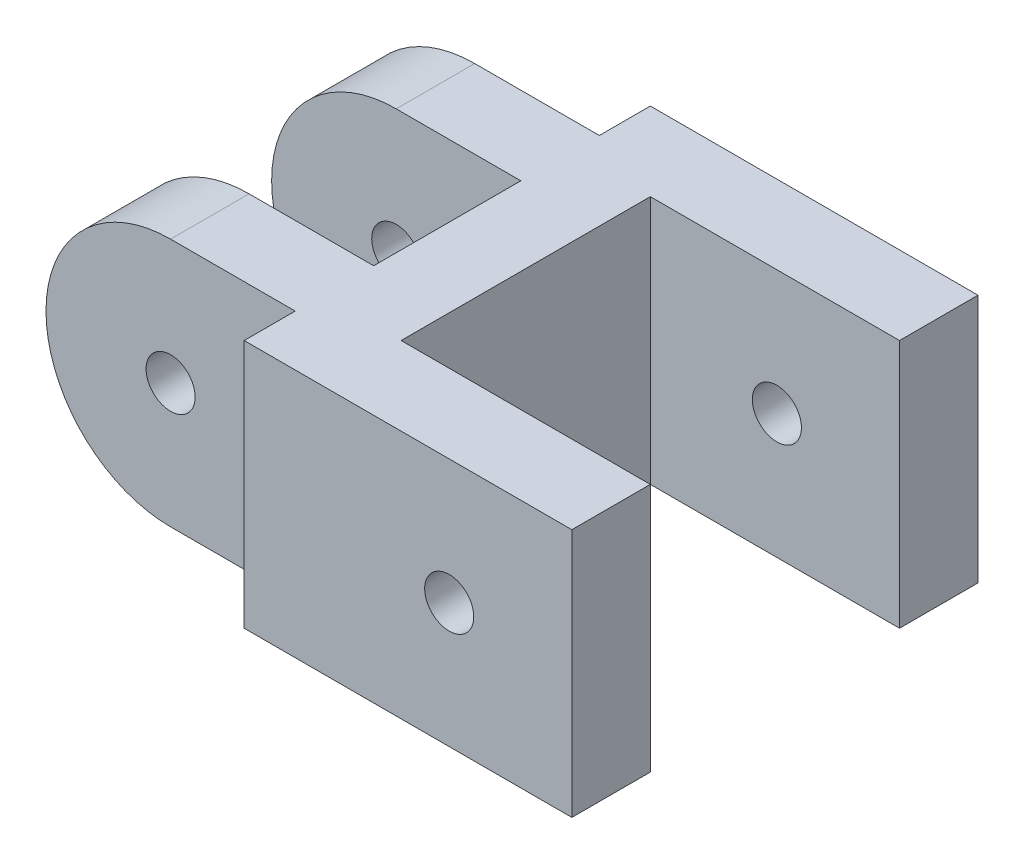
ISO-10303-21;
HEADER;
FILE_DESCRIPTION(('STEP AP214'),'2;1');
FILE_NAME('part.step','',(''),(''),'','','');
FILE_SCHEMA(('AUTOMOTIVE_DESIGN { 1 0 10303 214 1 1 1 1 }'));
ENDSEC;
DATA;
#1=APPLICATION_CONTEXT('core data for automotive mechanical design processes');
#2=APPLICATION_PROTOCOL_DEFINITION('international standard','automotive_design',2000,#1);
#3=PRODUCT_CONTEXT('',#1,'mechanical');
#4=PRODUCT('Part','Part','',(#3));
#5=PRODUCT_RELATED_PRODUCT_CATEGORY('part','',(#4));
#6=PRODUCT_DEFINITION_FORMATION('','',#4);
#7=PRODUCT_DEFINITION_CONTEXT('part definition',#1,'design');
#8=PRODUCT_DEFINITION('design','',#6,#7);
#9=PRODUCT_DEFINITION_SHAPE('','',#8);
#10=(LENGTH_UNIT() NAMED_UNIT(*) SI_UNIT(.MILLI.,.METRE.));
#11=(NAMED_UNIT(*) PLANE_ANGLE_UNIT() SI_UNIT($,.RADIAN.));
#12=(NAMED_UNIT(*) SI_UNIT($,.STERADIAN.) SOLID_ANGLE_UNIT());
#13=UNCERTAINTY_MEASURE_WITH_UNIT(LENGTH_MEASURE(1.E-05),#10,'distance_accuracy_value','');
#14=(GEOMETRIC_REPRESENTATION_CONTEXT(3) GLOBAL_UNCERTAINTY_ASSIGNED_CONTEXT((#13)) GLOBAL_UNIT_ASSIGNED_CONTEXT((#10,
#11,#12)) REPRESENTATION_CONTEXT('',''));
#15=CARTESIAN_POINT('',(0.,0.,0.));
#16=DIRECTION('',(0.,0.,1.));
#17=DIRECTION('',(1.,0.,0.));
#18=AXIS2_PLACEMENT_3D('',#15,#16,#17);
#19=CARTESIAN_POINT('',(10.375,25.4,-23.95));
#20=DIRECTION('',(-1.,0.,0.));
#21=DIRECTION('',(0.,0.,1.));
#22=AXIS2_PLACEMENT_3D('',#19,#20,#21);
#23=PLANE('',#22);
#24=DIRECTION('',(0.,0.,-1.));
#25=VECTOR('',#24,1.);
#26=CARTESIAN_POINT('',(10.375,0.,-23.95));
#27=LINE('',#26,#25);
#28=CARTESIAN_POINT('',(10.375,0.,-15.95));
#29=VERTEX_POINT('',#28);
#30=CARTESIAN_POINT('',(10.375,0.,-23.95));
#31=VERTEX_POINT('',#30);
#32=EDGE_CURVE('E183',#29,#31,#27,.T.);
#33=ORIENTED_EDGE('',*,*,#32,.T.);
#34=DIRECTION('',(0.,-1.,0.));
#35=VECTOR('',#34,1.);
#36=CARTESIAN_POINT('',(10.375,25.4,-23.95));
#37=LINE('',#36,#35);
#38=CARTESIAN_POINT('',(10.375,25.4,-23.95));
#39=VERTEX_POINT('',#38);
#40=EDGE_CURVE('E163',#39,#31,#37,.T.);
#41=ORIENTED_EDGE('',*,*,#40,.F.);
#42=DIRECTION('',(0.,0.,-1.));
#43=VECTOR('',#42,1.);
#44=CARTESIAN_POINT('',(10.375,25.4,-23.95));
#45=LINE('',#44,#43);
#46=CARTESIAN_POINT('',(10.375,25.4,-15.95));
#47=VERTEX_POINT('',#46);
#48=EDGE_CURVE('E170',#47,#39,#45,.T.);
#49=ORIENTED_EDGE('',*,*,#48,.F.);
#50=DIRECTION('',(0.,-1.,0.));
#51=VECTOR('',#50,1.);
#52=CARTESIAN_POINT('',(10.375,25.4,-15.95));
#53=LINE('',#52,#51);
#54=EDGE_CURVE('E251',#47,#29,#53,.T.);
#55=ORIENTED_EDGE('',*,*,#54,.T.);
#56=EDGE_LOOP('',(#33,#41,#49,#55));
#57=FACE_BOUND('',#56,.T.);
#58=ADVANCED_FACE('F33',(#57),#23,.F.);
#59=CARTESIAN_POINT('',(-23.025,25.4,-23.95));
#60=DIRECTION('',(0.,0.,1.));
#61=DIRECTION('',(1.,0.,0.));
#62=AXIS2_PLACEMENT_3D('',#59,#60,#61);
#63=PLANE('',#62);
#64=CARTESIAN_POINT('',(-2.12500000000001,12.7,-23.95));
#65=DIRECTION('',(0.,0.,1.));
#66=DIRECTION('',(1.,0.,0.));
#67=AXIS2_PLACEMENT_3D('',#64,#65,#66);
#68=CIRCLE('',#67,2.5);
#69=CARTESIAN_POINT('',(0.374999999999992,12.7,-23.95));
#70=VERTEX_POINT('',#69);
#71=EDGE_CURVE('E547',#70,#70,#68,.F.);
#72=ORIENTED_EDGE('',*,*,#71,.F.);
#73=EDGE_LOOP('',(#72));
#74=FACE_BOUND('',#73,.T.);
#75=DIRECTION('',(-1.,0.,0.));
#76=VECTOR('',#75,1.);
#77=CARTESIAN_POINT('',(-23.025,0.,-23.95));
#78=LINE('',#77,#76);
#79=CARTESIAN_POINT('',(-23.025,0.,-23.95));
#80=VERTEX_POINT('',#79);
#81=EDGE_CURVE('E253',#31,#80,#78,.T.);
#82=ORIENTED_EDGE('',*,*,#81,.T.);
#83=DIRECTION('',(0.,-1.,0.));
#84=VECTOR('',#83,1.);
#85=CARTESIAN_POINT('',(-23.025,25.4,-23.95));
#86=LINE('',#85,#84);
#87=CARTESIAN_POINT('',(-23.025,25.4,-23.95));
#88=VERTEX_POINT('',#87);
#89=EDGE_CURVE('E166',#88,#80,#86,.T.);
#90=ORIENTED_EDGE('',*,*,#89,.F.);
#91=DIRECTION('',(-1.,0.,0.));
#92=VECTOR('',#91,1.);
#93=CARTESIAN_POINT('',(-23.025,25.4,-23.95));
#94=LINE('',#93,#92);
#95=EDGE_CURVE('E159',#39,#88,#94,.T.);
#96=ORIENTED_EDGE('',*,*,#95,.F.);
#97=ORIENTED_EDGE('',*,*,#40,.T.);
#98=EDGE_LOOP('',(#82,#90,#96,#97));
#99=FACE_BOUND('',#98,.T.);
#100=ADVANCED_FACE('F161',(#74,#99),#63,.F.);
#101=CARTESIAN_POINT('',(-23.025,25.4,-18.75));
#102=DIRECTION('',(1.,0.,0.));
#103=DIRECTION('',(0.,0.,-1.));
#104=AXIS2_PLACEMENT_3D('',#101,#102,#103);
#105=PLANE('',#104);
#106=DIRECTION('',(0.,0.,1.));
#107=VECTOR('',#106,1.);
#108=CARTESIAN_POINT('',(-23.025,0.,-18.75));
#109=LINE('',#108,#107);
#110=CARTESIAN_POINT('',(-23.025,0.,-18.75));
#111=VERTEX_POINT('',#110);
#112=EDGE_CURVE('E255',#80,#111,#109,.T.);
#113=ORIENTED_EDGE('',*,*,#112,.T.);
#114=DIRECTION('',(0.,-1.,0.));
#115=VECTOR('',#114,1.);
#116=CARTESIAN_POINT('',(-23.025,25.4,-18.75));
#117=LINE('',#116,#115);
#118=CARTESIAN_POINT('',(-23.025,25.4,-18.75));
#119=VERTEX_POINT('',#118);
#120=EDGE_CURVE('E188',#119,#111,#117,.T.);
#121=ORIENTED_EDGE('',*,*,#120,.F.);
#122=DIRECTION('',(0.,0.,1.));
#123=VECTOR('',#122,1.);
#124=CARTESIAN_POINT('',(-23.025,25.4,-18.75));
#125=LINE('',#124,#123);
#126=EDGE_CURVE('E169',#88,#119,#125,.T.);
#127=ORIENTED_EDGE('',*,*,#126,.F.);
#128=ORIENTED_EDGE('',*,*,#89,.T.);
#129=EDGE_LOOP('',(#113,#121,#127,#128));
#130=FACE_BOUND('',#129,.T.);
#131=ADVANCED_FACE('F369',(#130),#105,.F.);
#132=CARTESIAN_POINT('',(-48.425,25.4,-18.75));
#133=DIRECTION('',(0.,0.,1.));
#134=DIRECTION('',(1.,0.,0.));
#135=AXIS2_PLACEMENT_3D('',#132,#133,#134);
#136=PLANE('',#135);
#137=CARTESIAN_POINT('',(-35.725,12.7,-18.75));
#138=DIRECTION('',(0.,0.,1.));
#139=DIRECTION('',(1.,0.,0.));
#140=AXIS2_PLACEMENT_3D('',#137,#138,#139);
#141=CIRCLE('',#140,2.5);
#142=CARTESIAN_POINT('',(-33.225,12.7,-18.75));
#143=VERTEX_POINT('',#142);
#144=EDGE_CURVE('E224',#143,#143,#141,.F.);
#145=ORIENTED_EDGE('',*,*,#144,.F.);
#146=EDGE_LOOP('',(#145));
#147=FACE_BOUND('',#146,.T.);
#148=CARTESIAN_POINT('',(-35.725,12.7,-18.75));
#149=DIRECTION('',(0.,0.,1.));
#150=DIRECTION('',(1.,0.,0.));
#151=AXIS2_PLACEMENT_3D('',#148,#149,#150);
#152=CIRCLE('',#151,12.7);
#153=CARTESIAN_POINT('',(-35.725,0.,-18.75));
#154=VERTEX_POINT('',#153);
#155=CARTESIAN_POINT('',(-48.425,12.7,-18.75));
#156=VERTEX_POINT('',#155);
#157=EDGE_CURVE('E198',#154,#156,#152,.F.);
#158=ORIENTED_EDGE('',*,*,#157,.T.);
#159=CARTESIAN_POINT('',(-35.725,12.7,-18.75));
#160=DIRECTION('',(0.,0.,1.));
#161=DIRECTION('',(1.,0.,0.));
#162=AXIS2_PLACEMENT_3D('',#159,#160,#161);
#163=CIRCLE('',#162,12.7);
#164=CARTESIAN_POINT('',(-35.725,25.4,-18.75));
#165=VERTEX_POINT('',#164);
#166=EDGE_CURVE('E200',#156,#165,#163,.F.);
#167=ORIENTED_EDGE('',*,*,#166,.T.);
#168=DIRECTION('',(-1.,0.,0.));
#169=VECTOR('',#168,1.);
#170=CARTESIAN_POINT('',(-48.425,25.4,-18.75));
#171=LINE('',#170,#169);
#172=EDGE_CURVE('E229',#119,#165,#171,.T.);
#173=ORIENTED_EDGE('',*,*,#172,.F.);
#174=ORIENTED_EDGE('',*,*,#120,.T.);
#175=DIRECTION('',(-1.,0.,0.));
#176=VECTOR('',#175,1.);
#177=CARTESIAN_POINT('',(-48.425,0.,-18.75));
#178=LINE('',#177,#176);
#179=EDGE_CURVE('E257',#111,#154,#178,.T.);
#180=ORIENTED_EDGE('',*,*,#179,.T.);
#181=EDGE_LOOP('',(#158,#167,#173,#174,#180));
#182=FACE_BOUND('',#181,.T.);
#183=ADVANCED_FACE('F308',(#147,#182),#136,.F.);
#184=CARTESIAN_POINT('',(-23.025,25.4,-10.75));
#185=DIRECTION('',(0.,0.,-1.));
#186=DIRECTION('',(-1.,0.,0.));
#187=AXIS2_PLACEMENT_3D('',#184,#185,#186);
#188=PLANE('',#187);
#189=CARTESIAN_POINT('',(-35.725,12.7,-10.75));
#190=DIRECTION('',(0.,0.,-1.));
#191=DIRECTION('',(-1.,0.,0.));
#192=AXIS2_PLACEMENT_3D('',#189,#190,#191);
#193=CIRCLE('',#192,2.5);
#194=CARTESIAN_POINT('',(-38.225,12.7,-10.75));
#195=VERTEX_POINT('',#194);
#196=EDGE_CURVE('E215',#195,#195,#193,.T.);
#197=ORIENTED_EDGE('',*,*,#196,.T.);
#198=EDGE_LOOP('',(#197));
#199=FACE_BOUND('',#198,.T.);
#200=DIRECTION('',(1.,0.,0.));
#201=VECTOR('',#200,1.);
#202=CARTESIAN_POINT('',(-23.025,25.4,-10.75));
#203=LINE('',#202,#201);
#204=CARTESIAN_POINT('',(-35.725,25.4,-10.75));
#205=VERTEX_POINT('',#204);
#206=CARTESIAN_POINT('',(-23.025,25.4,-10.75));
#207=VERTEX_POINT('',#206);
#208=EDGE_CURVE('E231',#205,#207,#203,.T.);
#209=ORIENTED_EDGE('',*,*,#208,.F.);
#210=CARTESIAN_POINT('',(-35.725,12.7,-10.75));
#211=DIRECTION('',(0.,0.,-1.));
#212=DIRECTION('',(-1.,0.,0.));
#213=AXIS2_PLACEMENT_3D('',#210,#211,#212);
#214=CIRCLE('',#213,12.7);
#215=CARTESIAN_POINT('',(-48.425,12.7,-10.75));
#216=VERTEX_POINT('',#215);
#217=EDGE_CURVE('E196',#205,#216,#214,.F.);
#218=ORIENTED_EDGE('',*,*,#217,.T.);
#219=CARTESIAN_POINT('',(-35.725,12.7,-10.75));
#220=DIRECTION('',(0.,0.,-1.));
#221=DIRECTION('',(-1.,0.,0.));
#222=AXIS2_PLACEMENT_3D('',#219,#220,#221);
#223=CIRCLE('',#222,12.7);
#224=CARTESIAN_POINT('',(-35.725,0.,-10.75));
#225=VERTEX_POINT('',#224);
#226=EDGE_CURVE('E194',#216,#225,#223,.F.);
#227=ORIENTED_EDGE('',*,*,#226,.T.);
#228=DIRECTION('',(1.,0.,0.));
#229=VECTOR('',#228,1.);
#230=CARTESIAN_POINT('',(-23.025,0.,-10.75));
#231=LINE('',#230,#229);
#232=CARTESIAN_POINT('',(-23.025,0.,-10.75));
#233=VERTEX_POINT('',#232);
#234=EDGE_CURVE('E260',#225,#233,#231,.T.);
#235=ORIENTED_EDGE('',*,*,#234,.T.);
#236=DIRECTION('',(0.,-1.,0.));
#237=VECTOR('',#236,1.);
#238=CARTESIAN_POINT('',(-23.025,25.4,-10.75));
#239=LINE('',#238,#237);
#240=EDGE_CURVE('E301',#207,#233,#239,.T.);
#241=ORIENTED_EDGE('',*,*,#240,.F.);
#242=EDGE_LOOP('',(#209,#218,#227,#235,#241));
#243=FACE_BOUND('',#242,.T.);
#244=ADVANCED_FACE('F327',(#199,#243),#188,.F.);
#245=CARTESIAN_POINT('',(-23.025,25.4,4.25000000000001));
#246=DIRECTION('',(1.,0.,0.));
#247=DIRECTION('',(0.,0.,-1.));
#248=AXIS2_PLACEMENT_3D('',#245,#246,#247);
#249=PLANE('',#248);
#250=DIRECTION('',(0.,0.,1.));
#251=VECTOR('',#250,1.);
#252=CARTESIAN_POINT('',(-23.025,0.,4.25000000000001));
#253=LINE('',#252,#251);
#254=CARTESIAN_POINT('',(-23.025,0.,4.25000000000001));
#255=VERTEX_POINT('',#254);
#256=EDGE_CURVE('E262',#233,#255,#253,.T.);
#257=ORIENTED_EDGE('',*,*,#256,.T.);
#258=DIRECTION('',(0.,-1.,0.));
#259=VECTOR('',#258,1.);
#260=CARTESIAN_POINT('',(-23.025,25.4,4.25000000000001));
#261=LINE('',#260,#259);
#262=CARTESIAN_POINT('',(-23.025,25.4,4.25000000000001));
#263=VERTEX_POINT('',#262);
#264=EDGE_CURVE('E298',#263,#255,#261,.T.);
#265=ORIENTED_EDGE('',*,*,#264,.F.);
#266=DIRECTION('',(0.,0.,1.));
#267=VECTOR('',#266,1.);
#268=CARTESIAN_POINT('',(-23.025,25.4,4.25000000000001));
#269=LINE('',#268,#267);
#270=EDGE_CURVE('E233',#207,#263,#269,.T.);
#271=ORIENTED_EDGE('',*,*,#270,.F.);
#272=ORIENTED_EDGE('',*,*,#240,.T.);
#273=EDGE_LOOP('',(#257,#265,#271,#272));
#274=FACE_BOUND('',#273,.T.);
#275=ADVANCED_FACE('F334',(#274),#249,.F.);
#276=CARTESIAN_POINT('',(-48.425,25.4,4.25000000000001));
#277=DIRECTION('',(0.,0.,1.));
#278=DIRECTION('',(1.,0.,0.));
#279=AXIS2_PLACEMENT_3D('',#276,#277,#278);
#280=PLANE('',#279);
#281=CARTESIAN_POINT('',(-35.725,12.7,4.25));
#282=DIRECTION('',(0.,0.,1.));
#283=DIRECTION('',(1.,0.,0.));
#284=AXIS2_PLACEMENT_3D('',#281,#282,#283);
#285=CIRCLE('',#284,2.5);
#286=CARTESIAN_POINT('',(-33.225,12.7,4.25));
#287=VERTEX_POINT('',#286);
#288=EDGE_CURVE('E219',#287,#287,#285,.T.);
#289=ORIENTED_EDGE('',*,*,#288,.T.);
#290=EDGE_LOOP('',(#289));
#291=FACE_BOUND('',#290,.T.);
#292=DIRECTION('',(-1.,0.,0.));
#293=VECTOR('',#292,1.);
#294=CARTESIAN_POINT('',(-48.425,0.,4.25000000000001));
#295=LINE('',#294,#293);
#296=CARTESIAN_POINT('',(-35.725,0.,4.25000000000001));
#297=VERTEX_POINT('',#296);
#298=EDGE_CURVE('E264',#255,#297,#295,.T.);
#299=ORIENTED_EDGE('',*,*,#298,.T.);
#300=CARTESIAN_POINT('',(-35.725,12.7,4.25000000000001));
#301=DIRECTION('',(0.,0.,1.));
#302=DIRECTION('',(1.,0.,0.));
#303=AXIS2_PLACEMENT_3D('',#300,#301,#302);
#304=CIRCLE('',#303,12.7);
#305=CARTESIAN_POINT('',(-48.425,12.7,4.25000000000001));
#306=VERTEX_POINT('',#305);
#307=EDGE_CURVE('E11',#297,#306,#304,.F.);
#308=ORIENTED_EDGE('',*,*,#307,.T.);
#309=CARTESIAN_POINT('',(-35.725,12.7,4.25000000000001));
#310=DIRECTION('',(0.,0.,1.));
#311=DIRECTION('',(1.,0.,0.));
#312=AXIS2_PLACEMENT_3D('',#309,#310,#311);
#313=CIRCLE('',#312,12.7);
#314=CARTESIAN_POINT('',(-35.725,25.4,4.25000000000001));
#315=VERTEX_POINT('',#314);
#316=EDGE_CURVE('E42',#306,#315,#313,.F.);
#317=ORIENTED_EDGE('',*,*,#316,.T.);
#318=DIRECTION('',(-1.,0.,0.));
#319=VECTOR('',#318,1.);
#320=CARTESIAN_POINT('',(-48.425,25.4,4.25000000000001));
#321=LINE('',#320,#319);
#322=EDGE_CURVE('E235',#263,#315,#321,.T.);
#323=ORIENTED_EDGE('',*,*,#322,.F.);
#324=ORIENTED_EDGE('',*,*,#264,.T.);
#325=EDGE_LOOP('',(#299,#308,#317,#323,#324));
#326=FACE_BOUND('',#325,.T.);
#327=ADVANCED_FACE('F336',(#291,#326),#280,.F.);
#328=CARTESIAN_POINT('',(-23.025,25.4,12.25));
#329=DIRECTION('',(0.,0.,-1.));
#330=DIRECTION('',(-1.,0.,0.));
#331=AXIS2_PLACEMENT_3D('',#328,#329,#330);
#332=PLANE('',#331);
#333=CARTESIAN_POINT('',(-35.725,12.7,12.25));
#334=DIRECTION('',(0.,0.,1.));
#335=DIRECTION('',(1.,0.,0.));
#336=AXIS2_PLACEMENT_3D('',#333,#334,#335);
#337=CIRCLE('',#336,2.5);
#338=CARTESIAN_POINT('',(-33.225,12.7,12.25));
#339=VERTEX_POINT('',#338);
#340=EDGE_CURVE('E542',#339,#339,#337,.T.);
#341=ORIENTED_EDGE('',*,*,#340,.F.);
#342=EDGE_LOOP('',(#341));
#343=FACE_BOUND('',#342,.T.);
#344=CARTESIAN_POINT('',(-35.725,12.7,12.25));
#345=DIRECTION('',(0.,0.,-1.));
#346=DIRECTION('',(-1.,0.,0.));
#347=AXIS2_PLACEMENT_3D('',#344,#345,#346);
#348=CIRCLE('',#347,12.7);
#349=CARTESIAN_POINT('',(-35.725,25.4,12.25));
#350=VERTEX_POINT('',#349);
#351=CARTESIAN_POINT('',(-48.425,12.7,12.25));
#352=VERTEX_POINT('',#351);
#353=EDGE_CURVE('E56',#350,#352,#348,.F.);
#354=ORIENTED_EDGE('',*,*,#353,.T.);
#355=CARTESIAN_POINT('',(-35.725,12.7,12.25));
#356=DIRECTION('',(0.,0.,-1.));
#357=DIRECTION('',(-1.,0.,0.));
#358=AXIS2_PLACEMENT_3D('',#355,#356,#357);
#359=CIRCLE('',#358,12.7);
#360=CARTESIAN_POINT('',(-35.725,0.,12.25));
#361=VERTEX_POINT('',#360);
#362=EDGE_CURVE('E208',#352,#361,#359,.F.);
#363=ORIENTED_EDGE('',*,*,#362,.T.);
#364=DIRECTION('',(1.,0.,0.));
#365=VECTOR('',#364,1.);
#366=CARTESIAN_POINT('',(-23.025,0.,12.25));
#367=LINE('',#366,#365);
#368=CARTESIAN_POINT('',(-23.025,0.,12.25));
#369=VERTEX_POINT('',#368);
#370=EDGE_CURVE('E266',#361,#369,#367,.T.);
#371=ORIENTED_EDGE('',*,*,#370,.T.);
#372=DIRECTION('',(0.,-1.,0.));
#373=VECTOR('',#372,1.);
#374=CARTESIAN_POINT('',(-23.025,25.4,12.25));
#375=LINE('',#374,#373);
#376=CARTESIAN_POINT('',(-23.025,25.4,12.25));
#377=VERTEX_POINT('',#376);
#378=EDGE_CURVE('E295',#377,#369,#375,.T.);
#379=ORIENTED_EDGE('',*,*,#378,.F.);
#380=DIRECTION('',(1.,0.,0.));
#381=VECTOR('',#380,1.);
#382=CARTESIAN_POINT('',(-23.025,25.4,12.25));
#383=LINE('',#382,#381);
#384=EDGE_CURVE('E238',#350,#377,#383,.T.);
#385=ORIENTED_EDGE('',*,*,#384,.F.);
#386=EDGE_LOOP('',(#354,#363,#371,#379,#385));
#387=FACE_BOUND('',#386,.T.);
#388=ADVANCED_FACE('F339',(#343,#387),#332,.F.);
#389=CARTESIAN_POINT('',(-23.025,25.4,17.45));
#390=DIRECTION('',(1.,0.,0.));
#391=DIRECTION('',(0.,0.,-1.));
#392=AXIS2_PLACEMENT_3D('',#389,#390,#391);
#393=PLANE('',#392);
#394=DIRECTION('',(0.,0.,1.));
#395=VECTOR('',#394,1.);
#396=CARTESIAN_POINT('',(-23.025,0.,17.45));
#397=LINE('',#396,#395);
#398=CARTESIAN_POINT('',(-23.025,0.,17.45));
#399=VERTEX_POINT('',#398);
#400=EDGE_CURVE('E268',#369,#399,#397,.T.);
#401=ORIENTED_EDGE('',*,*,#400,.T.);
#402=DIRECTION('',(0.,-1.,0.));
#403=VECTOR('',#402,1.);
#404=CARTESIAN_POINT('',(-23.025,25.4,17.45));
#405=LINE('',#404,#403);
#406=CARTESIAN_POINT('',(-23.025,25.4,17.45));
#407=VERTEX_POINT('',#406);
#408=EDGE_CURVE('E292',#407,#399,#405,.T.);
#409=ORIENTED_EDGE('',*,*,#408,.F.);
#410=DIRECTION('',(0.,0.,1.));
#411=VECTOR('',#410,1.);
#412=CARTESIAN_POINT('',(-23.025,25.4,17.45));
#413=LINE('',#412,#411);
#414=EDGE_CURVE('E240',#377,#407,#413,.T.);
#415=ORIENTED_EDGE('',*,*,#414,.F.);
#416=ORIENTED_EDGE('',*,*,#378,.T.);
#417=EDGE_LOOP('',(#401,#409,#415,#416));
#418=FACE_BOUND('',#417,.T.);
#419=ADVANCED_FACE('F345',(#418),#393,.F.);
#420=CARTESIAN_POINT('',(10.375,25.4,17.45));
#421=DIRECTION('',(0.,0.,-1.));
#422=DIRECTION('',(-1.,0.,0.));
#423=AXIS2_PLACEMENT_3D('',#420,#421,#422);
#424=PLANE('',#423);
#425=CARTESIAN_POINT('',(-2.12500000000001,12.7,17.45));
#426=DIRECTION('',(0.,0.,1.));
#427=DIRECTION('',(1.,0.,0.));
#428=AXIS2_PLACEMENT_3D('',#425,#426,#427);
#429=CIRCLE('',#428,2.5);
#430=CARTESIAN_POINT('',(0.374999999999992,12.7,17.45));
#431=VERTEX_POINT('',#430);
#432=EDGE_CURVE('E538',#431,#431,#429,.T.);
#433=ORIENTED_EDGE('',*,*,#432,.F.);
#434=EDGE_LOOP('',(#433));
#435=FACE_BOUND('',#434,.T.);
#436=DIRECTION('',(1.,0.,0.));
#437=VECTOR('',#436,1.);
#438=CARTESIAN_POINT('',(10.375,0.,17.45));
#439=LINE('',#438,#437);
#440=CARTESIAN_POINT('',(10.375,0.,17.45));
#441=VERTEX_POINT('',#440);
#442=EDGE_CURVE('E270',#399,#441,#439,.T.);
#443=ORIENTED_EDGE('',*,*,#442,.T.);
#444=DIRECTION('',(0.,-1.,0.));
#445=VECTOR('',#444,1.);
#446=CARTESIAN_POINT('',(10.375,25.4,17.45));
#447=LINE('',#446,#445);
#448=CARTESIAN_POINT('',(10.375,25.4,17.45));
#449=VERTEX_POINT('',#448);
#450=EDGE_CURVE('E289',#449,#441,#447,.T.);
#451=ORIENTED_EDGE('',*,*,#450,.F.);
#452=DIRECTION('',(1.,0.,0.));
#453=VECTOR('',#452,1.);
#454=CARTESIAN_POINT('',(10.375,25.4,17.45));
#455=LINE('',#454,#453);
#456=EDGE_CURVE('E242',#407,#449,#455,.T.);
#457=ORIENTED_EDGE('',*,*,#456,.F.);
#458=ORIENTED_EDGE('',*,*,#408,.T.);
#459=EDGE_LOOP('',(#443,#451,#457,#458));
#460=FACE_BOUND('',#459,.T.);
#461=ADVANCED_FACE('F351',(#435,#460),#424,.F.);
#462=CARTESIAN_POINT('',(10.375,25.4,9.45000000000001));
#463=DIRECTION('',(-1.,0.,0.));
#464=DIRECTION('',(0.,0.,1.));
#465=AXIS2_PLACEMENT_3D('',#462,#463,#464);
#466=PLANE('',#465);
#467=DIRECTION('',(0.,0.,-1.));
#468=VECTOR('',#467,1.);
#469=CARTESIAN_POINT('',(10.375,0.,9.45000000000001));
#470=LINE('',#469,#468);
#471=CARTESIAN_POINT('',(10.375,0.,9.45000000000001));
#472=VERTEX_POINT('',#471);
#473=EDGE_CURVE('E272',#441,#472,#470,.T.);
#474=ORIENTED_EDGE('',*,*,#473,.T.);
#475=DIRECTION('',(0.,-1.,0.));
#476=VECTOR('',#475,1.);
#477=CARTESIAN_POINT('',(10.375,25.4,9.45000000000001));
#478=LINE('',#477,#476);
#479=CARTESIAN_POINT('',(10.375,25.4,9.45000000000001));
#480=VERTEX_POINT('',#479);
#481=EDGE_CURVE('E286',#480,#472,#478,.T.);
#482=ORIENTED_EDGE('',*,*,#481,.F.);
#483=DIRECTION('',(0.,0.,-1.));
#484=VECTOR('',#483,1.);
#485=CARTESIAN_POINT('',(10.375,25.4,9.45000000000001));
#486=LINE('',#485,#484);
#487=EDGE_CURVE('E244',#449,#480,#486,.T.);
#488=ORIENTED_EDGE('',*,*,#487,.F.);
#489=ORIENTED_EDGE('',*,*,#450,.T.);
#490=EDGE_LOOP('',(#474,#482,#488,#489));
#491=FACE_BOUND('',#490,.T.);
#492=ADVANCED_FACE('F355',(#491),#466,.F.);
#493=CARTESIAN_POINT('',(-15.025,25.4,9.45000000000001));
#494=DIRECTION('',(0.,0.,1.));
#495=DIRECTION('',(1.,0.,0.));
#496=AXIS2_PLACEMENT_3D('',#493,#494,#495);
#497=PLANE('',#496);
#498=CARTESIAN_POINT('',(-2.12500000000001,12.7,9.45000000000001));
#499=DIRECTION('',(0.,0.,1.));
#500=DIRECTION('',(1.,0.,0.));
#501=AXIS2_PLACEMENT_3D('',#498,#499,#500);
#502=CIRCLE('',#501,2.5);
#503=CARTESIAN_POINT('',(0.374999999999992,12.7,9.45));
#504=VERTEX_POINT('',#503);
#505=EDGE_CURVE('E541',#504,#504,#502,.T.);
#506=ORIENTED_EDGE('',*,*,#505,.T.);
#507=EDGE_LOOP('',(#506));
#508=FACE_BOUND('',#507,.T.);
#509=DIRECTION('',(-1.,0.,0.));
#510=VECTOR('',#509,1.);
#511=CARTESIAN_POINT('',(-15.025,0.,9.45000000000001));
#512=LINE('',#511,#510);
#513=CARTESIAN_POINT('',(-15.025,0.,9.45000000000001));
#514=VERTEX_POINT('',#513);
#515=EDGE_CURVE('E274',#472,#514,#512,.T.);
#516=ORIENTED_EDGE('',*,*,#515,.T.);
#517=DIRECTION('',(0.,-1.,0.));
#518=VECTOR('',#517,1.);
#519=CARTESIAN_POINT('',(-15.025,25.4,9.45000000000001));
#520=LINE('',#519,#518);
#521=CARTESIAN_POINT('',(-15.025,25.4,9.45000000000001));
#522=VERTEX_POINT('',#521);
#523=EDGE_CURVE('E283',#522,#514,#520,.T.);
#524=ORIENTED_EDGE('',*,*,#523,.F.);
#525=DIRECTION('',(-1.,0.,0.));
#526=VECTOR('',#525,1.);
#527=CARTESIAN_POINT('',(-15.025,25.4,9.45000000000001));
#528=LINE('',#527,#526);
#529=EDGE_CURVE('E246',#480,#522,#528,.T.);
#530=ORIENTED_EDGE('',*,*,#529,.F.);
#531=ORIENTED_EDGE('',*,*,#481,.T.);
#532=EDGE_LOOP('',(#516,#524,#530,#531));
#533=FACE_BOUND('',#532,.T.);
#534=ADVANCED_FACE('F360',(#508,#533),#497,.F.);
#535=CARTESIAN_POINT('',(-15.025,25.4,-15.95));
#536=DIRECTION('',(-1.,0.,0.));
#537=DIRECTION('',(0.,0.,1.));
#538=AXIS2_PLACEMENT_3D('',#535,#536,#537);
#539=PLANE('',#538);
#540=DIRECTION('',(0.,0.,-1.));
#541=VECTOR('',#540,1.);
#542=CARTESIAN_POINT('',(-15.025,0.,-15.95));
#543=LINE('',#542,#541);
#544=CARTESIAN_POINT('',(-15.025,0.,-15.95));
#545=VERTEX_POINT('',#544);
#546=EDGE_CURVE('E276',#514,#545,#543,.T.);
#547=ORIENTED_EDGE('',*,*,#546,.T.);
#548=DIRECTION('',(0.,-1.,0.));
#549=VECTOR('',#548,1.);
#550=CARTESIAN_POINT('',(-15.025,25.4,-15.95));
#551=LINE('',#550,#549);
#552=CARTESIAN_POINT('',(-15.025,25.4,-15.95));
#553=VERTEX_POINT('',#552);
#554=EDGE_CURVE('E280',#553,#545,#551,.T.);
#555=ORIENTED_EDGE('',*,*,#554,.F.);
#556=DIRECTION('',(0.,0.,-1.));
#557=VECTOR('',#556,1.);
#558=CARTESIAN_POINT('',(-15.025,25.4,-15.95));
#559=LINE('',#558,#557);
#560=EDGE_CURVE('E248',#522,#553,#559,.T.);
#561=ORIENTED_EDGE('',*,*,#560,.F.);
#562=ORIENTED_EDGE('',*,*,#523,.T.);
#563=EDGE_LOOP('',(#547,#555,#561,#562));
#564=FACE_BOUND('',#563,.T.);
#565=ADVANCED_FACE('F364',(#564),#539,.F.);
#566=CARTESIAN_POINT('',(10.375,25.4,-15.95));
#567=DIRECTION('',(0.,0.,-1.));
#568=DIRECTION('',(-1.,0.,0.));
#569=AXIS2_PLACEMENT_3D('',#566,#567,#568);
#570=PLANE('',#569);
#571=CARTESIAN_POINT('',(-2.12500000000001,12.7,-15.95));
#572=DIRECTION('',(0.,0.,-1.));
#573=DIRECTION('',(-1.,0.,0.));
#574=AXIS2_PLACEMENT_3D('',#571,#572,#573);
#575=CIRCLE('',#574,2.5);
#576=CARTESIAN_POINT('',(0.374999999999992,12.7,-15.95));
#577=VERTEX_POINT('',#576);
#578=EDGE_CURVE('E37',#577,#577,#575,.T.);
#579=ORIENTED_EDGE('',*,*,#578,.T.);
#580=EDGE_LOOP('',(#579));
#581=FACE_BOUND('',#580,.T.);
#582=DIRECTION('',(1.,0.,0.));
#583=VECTOR('',#582,1.);
#584=CARTESIAN_POINT('',(10.375,0.,-15.95));
#585=LINE('',#584,#583);
#586=EDGE_CURVE('E180',#545,#29,#585,.T.);
#587=ORIENTED_EDGE('',*,*,#586,.T.);
#588=ORIENTED_EDGE('',*,*,#54,.F.);
#589=DIRECTION('',(1.,0.,0.));
#590=VECTOR('',#589,1.);
#591=CARTESIAN_POINT('',(10.375,25.4,-15.95));
#592=LINE('',#591,#590);
#593=EDGE_CURVE('E176',#553,#47,#592,.T.);
#594=ORIENTED_EDGE('',*,*,#593,.F.);
#595=ORIENTED_EDGE('',*,*,#554,.T.);
#596=EDGE_LOOP('',(#587,#588,#594,#595));
#597=FACE_BOUND('',#596,.T.);
#598=ADVANCED_FACE('F368',(#581,#597),#570,.F.);
#599=CARTESIAN_POINT('',(0.,25.4,0.));
#600=DIRECTION('',(0.,-1.,0.));
#601=DIRECTION('',(0.,0.,-1.));
#602=AXIS2_PLACEMENT_3D('',#599,#600,#601);
#603=PLANE('',#602);
#604=ORIENTED_EDGE('',*,*,#172,.T.);
#605=DIRECTION('',(0.,0.,1.));
#606=VECTOR('',#605,1.);
#607=CARTESIAN_POINT('',(-35.725,25.4,0.));
#608=LINE('',#607,#606);
#609=EDGE_CURVE('E186',#165,#205,#608,.T.);
#610=ORIENTED_EDGE('',*,*,#609,.T.);
#611=ORIENTED_EDGE('',*,*,#208,.T.);
#612=ORIENTED_EDGE('',*,*,#270,.T.);
#613=ORIENTED_EDGE('',*,*,#322,.T.);
#614=DIRECTION('',(0.,0.,1.));
#615=VECTOR('',#614,1.);
#616=CARTESIAN_POINT('',(-35.725,25.4,0.));
#617=LINE('',#616,#615);
#618=EDGE_CURVE('E184',#315,#350,#617,.T.);
#619=ORIENTED_EDGE('',*,*,#618,.T.);
#620=ORIENTED_EDGE('',*,*,#384,.T.);
#621=ORIENTED_EDGE('',*,*,#414,.T.);
#622=ORIENTED_EDGE('',*,*,#456,.T.);
#623=ORIENTED_EDGE('',*,*,#487,.T.);
#624=ORIENTED_EDGE('',*,*,#529,.T.);
#625=ORIENTED_EDGE('',*,*,#560,.T.);
#626=ORIENTED_EDGE('',*,*,#593,.T.);
#627=ORIENTED_EDGE('',*,*,#48,.T.);
#628=ORIENTED_EDGE('',*,*,#95,.T.);
#629=ORIENTED_EDGE('',*,*,#126,.T.);
#630=EDGE_LOOP('',(#604,#610,#611,#612,#613,#619,#620,#621,#622,#623,#624,#625,#626,#627,#628,#629));
#631=FACE_BOUND('',#630,.T.);
#632=ADVANCED_FACE('F174',(#631),#603,.F.);
#633=CARTESIAN_POINT('',(0.,0.,0.));
#634=DIRECTION('',(0.,-1.,0.));
#635=DIRECTION('',(0.,0.,-1.));
#636=AXIS2_PLACEMENT_3D('',#633,#634,#635);
#637=PLANE('',#636);
#638=ORIENTED_EDGE('',*,*,#234,.F.);
#639=DIRECTION('',(0.,0.,1.));
#640=VECTOR('',#639,1.);
#641=CARTESIAN_POINT('',(-35.725,0.,-18.75));
#642=LINE('',#641,#640);
#643=EDGE_CURVE('E205',#225,#154,#642,.F.);
#644=ORIENTED_EDGE('',*,*,#643,.T.);
#645=ORIENTED_EDGE('',*,*,#179,.F.);
#646=ORIENTED_EDGE('',*,*,#112,.F.);
#647=ORIENTED_EDGE('',*,*,#81,.F.);
#648=ORIENTED_EDGE('',*,*,#32,.F.);
#649=ORIENTED_EDGE('',*,*,#586,.F.);
#650=ORIENTED_EDGE('',*,*,#546,.F.);
#651=ORIENTED_EDGE('',*,*,#515,.F.);
#652=ORIENTED_EDGE('',*,*,#473,.F.);
#653=ORIENTED_EDGE('',*,*,#442,.F.);
#654=ORIENTED_EDGE('',*,*,#400,.F.);
#655=ORIENTED_EDGE('',*,*,#370,.F.);
#656=DIRECTION('',(0.,0.,1.));
#657=VECTOR('',#656,1.);
#658=CARTESIAN_POINT('',(-35.725,0.,4.25000000000001));
#659=LINE('',#658,#657);
#660=EDGE_CURVE('E202',#361,#297,#659,.F.);
#661=ORIENTED_EDGE('',*,*,#660,.T.);
#662=ORIENTED_EDGE('',*,*,#298,.F.);
#663=ORIENTED_EDGE('',*,*,#256,.F.);
#664=EDGE_LOOP('',(#638,#644,#645,#646,#647,#648,#649,#650,#651,#652,#653,#654,#655,#661,#662,#663));
#665=FACE_BOUND('',#664,.T.);
#666=ADVANCED_FACE('F314',(#665),#637,.T.);
#667=CARTESIAN_POINT('',(-35.725,12.7,-10.75));
#668=DIRECTION('',(0.,0.,-1.));
#669=DIRECTION('',(-1.,0.,0.));
#670=AXIS2_PLACEMENT_3D('',#667,#668,#669);
#671=CYLINDRICAL_SURFACE('',#670,12.7);
#672=DIRECTION('',(0.,0.,1.));
#673=VECTOR('',#672,1.);
#674=CARTESIAN_POINT('',(-48.425,12.7,-10.75));
#675=LINE('',#674,#673);
#676=EDGE_CURVE('E211',#156,#216,#675,.T.);
#677=ORIENTED_EDGE('',*,*,#676,.F.);
#678=ORIENTED_EDGE('',*,*,#157,.F.);
#679=ORIENTED_EDGE('',*,*,#643,.F.);
#680=ORIENTED_EDGE('',*,*,#226,.F.);
#681=EDGE_LOOP('',(#677,#678,#679,#680));
#682=FACE_BOUND('',#681,.T.);
#683=ADVANCED_FACE('F320',(#682),#671,.T.);
#684=CARTESIAN_POINT('',(-35.725,12.7,0.));
#685=DIRECTION('',(0.,0.,1.));
#686=DIRECTION('',(1.,0.,0.));
#687=AXIS2_PLACEMENT_3D('',#684,#685,#686);
#688=CYLINDRICAL_SURFACE('',#687,12.7);
#689=ORIENTED_EDGE('',*,*,#166,.F.);
#690=ORIENTED_EDGE('',*,*,#676,.T.);
#691=ORIENTED_EDGE('',*,*,#217,.F.);
#692=ORIENTED_EDGE('',*,*,#609,.F.);
#693=EDGE_LOOP('',(#689,#690,#691,#692));
#694=FACE_BOUND('',#693,.T.);
#695=ADVANCED_FACE('F325',(#694),#688,.T.);
#696=CARTESIAN_POINT('',(-35.725,12.7,0.));
#697=DIRECTION('',(0.,0.,1.));
#698=DIRECTION('',(1.,0.,0.));
#699=AXIS2_PLACEMENT_3D('',#696,#697,#698);
#700=CYLINDRICAL_SURFACE('',#699,12.7);
#701=ORIENTED_EDGE('',*,*,#618,.F.);
#702=ORIENTED_EDGE('',*,*,#316,.F.);
#703=DIRECTION('',(0.,0.,1.));
#704=VECTOR('',#703,1.);
#705=CARTESIAN_POINT('',(-48.425,12.7,12.25));
#706=LINE('',#705,#704);
#707=EDGE_CURVE('E213',#352,#306,#706,.F.);
#708=ORIENTED_EDGE('',*,*,#707,.F.);
#709=ORIENTED_EDGE('',*,*,#353,.F.);
#710=EDGE_LOOP('',(#701,#702,#708,#709));
#711=FACE_BOUND('',#710,.T.);
#712=ADVANCED_FACE('F35',(#711),#700,.T.);
#713=CARTESIAN_POINT('',(-35.725,12.7,12.25));
#714=DIRECTION('',(0.,0.,-1.));
#715=DIRECTION('',(-1.,0.,0.));
#716=AXIS2_PLACEMENT_3D('',#713,#714,#715);
#717=CYLINDRICAL_SURFACE('',#716,12.7);
#718=ORIENTED_EDGE('',*,*,#307,.F.);
#719=ORIENTED_EDGE('',*,*,#660,.F.);
#720=ORIENTED_EDGE('',*,*,#362,.F.);
#721=ORIENTED_EDGE('',*,*,#707,.T.);
#722=EDGE_LOOP('',(#718,#719,#720,#721));
#723=FACE_BOUND('',#722,.T.);
#724=ADVANCED_FACE('F388',(#723),#717,.T.);
#725=CARTESIAN_POINT('',(-35.725,12.7,-25.8210678118655));
#726=DIRECTION('',(0.,0.,1.));
#727=DIRECTION('',(1.,0.,0.));
#728=AXIS2_PLACEMENT_3D('',#725,#726,#727);
#729=CYLINDRICAL_SURFACE('',#728,2.5);
#730=ORIENTED_EDGE('',*,*,#340,.T.);
#731=EDGE_LOOP('',(#730));
#732=FACE_BOUND('',#731,.T.);
#733=ORIENTED_EDGE('',*,*,#288,.F.);
#734=EDGE_LOOP('',(#733));
#735=FACE_BOUND('',#734,.T.);
#736=ADVANCED_FACE('F390',(#732,#735),#729,.F.);
#737=ORIENTED_EDGE('',*,*,#144,.T.);
#738=EDGE_LOOP('',(#737));
#739=FACE_BOUND('',#738,.T.);
#740=ORIENTED_EDGE('',*,*,#196,.F.);
#741=EDGE_LOOP('',(#740));
#742=FACE_BOUND('',#741,.T.);
#743=ADVANCED_FACE('F395',(#739,#742),#729,.F.);
#744=CARTESIAN_POINT('',(-2.12500000000001,12.7,-31.0210678118655));
#745=DIRECTION('',(0.,0.,1.));
#746=DIRECTION('',(1.,0.,0.));
#747=AXIS2_PLACEMENT_3D('',#744,#745,#746);
#748=CYLINDRICAL_SURFACE('',#747,2.5);
#749=CARTESIAN_POINT('',(0.374999999999992,12.7,-23.95));
#750=CARTESIAN_POINT('',(0.374999999999992,12.7,-23.8666666666667));
#751=CARTESIAN_POINT('',(0.374999999999992,12.7,-23.7833333333333));
#752=CARTESIAN_POINT('',(0.374999999999992,12.7,-23.6166666666667));
#753=CARTESIAN_POINT('',(0.374999999999992,12.7,-23.5333333333333));
#754=CARTESIAN_POINT('',(0.374999999999992,12.7,-23.3666666666667));
#755=CARTESIAN_POINT('',(0.374999999999992,12.7,-23.2833333333333));
#756=CARTESIAN_POINT('',(0.374999999999992,12.7,-23.1166666666667));
#757=CARTESIAN_POINT('',(0.374999999999992,12.7,-23.0333333333333));
#758=CARTESIAN_POINT('',(0.374999999999992,12.7,-22.8666666666667));
#759=CARTESIAN_POINT('',(0.374999999999992,12.7,-22.7833333333333));
#760=CARTESIAN_POINT('',(0.374999999999992,12.7,-22.6166666666667));
#761=CARTESIAN_POINT('',(0.374999999999992,12.7,-22.5333333333333));
#762=CARTESIAN_POINT('',(0.374999999999992,12.7,-22.3666666666667));
#763=CARTESIAN_POINT('',(0.374999999999992,12.7,-22.2833333333333));
#764=CARTESIAN_POINT('',(0.374999999999992,12.7,-22.1166666666667));
#765=CARTESIAN_POINT('',(0.374999999999992,12.7,-22.0333333333333));
#766=CARTESIAN_POINT('',(0.374999999999992,12.7,-21.8666666666667));
#767=CARTESIAN_POINT('',(0.374999999999992,12.7,-21.7833333333333));
#768=CARTESIAN_POINT('',(0.374999999999992,12.7,-21.6166666666667));
#769=CARTESIAN_POINT('',(0.374999999999992,12.7,-21.5333333333333));
#770=CARTESIAN_POINT('',(0.374999999999992,12.7,-21.3666666666667));
#771=CARTESIAN_POINT('',(0.374999999999992,12.7,-21.2833333333333));
#772=CARTESIAN_POINT('',(0.374999999999992,12.7,-21.1166666666667));
#773=CARTESIAN_POINT('',(0.374999999999992,12.7,-21.0333333333333));
#774=CARTESIAN_POINT('',(0.374999999999992,12.7,-20.8666666666667));
#775=CARTESIAN_POINT('',(0.374999999999992,12.7,-20.7833333333333));
#776=CARTESIAN_POINT('',(0.374999999999992,12.7,-20.6166666666667));
#777=CARTESIAN_POINT('',(0.374999999999992,12.7,-20.5333333333333));
#778=CARTESIAN_POINT('',(0.374999999999992,12.7,-20.3666666666667));
#779=CARTESIAN_POINT('',(0.374999999999992,12.7,-20.2833333333333));
#780=CARTESIAN_POINT('',(0.374999999999992,12.7,-20.1166666666667));
#781=CARTESIAN_POINT('',(0.374999999999992,12.7,-20.0333333333333));
#782=CARTESIAN_POINT('',(0.374999999999992,12.7,-19.8666666666667));
#783=CARTESIAN_POINT('',(0.374999999999992,12.7,-19.7833333333333));
#784=CARTESIAN_POINT('',(0.374999999999992,12.7,-19.6166666666667));
#785=CARTESIAN_POINT('',(0.374999999999992,12.7,-19.5333333333333));
#786=CARTESIAN_POINT('',(0.374999999999992,12.7,-19.3666666666667));
#787=CARTESIAN_POINT('',(0.374999999999992,12.7,-19.2833333333333));
#788=CARTESIAN_POINT('',(0.374999999999992,12.7,-19.1166666666667));
#789=CARTESIAN_POINT('',(0.374999999999992,12.7,-19.0333333333333));
#790=CARTESIAN_POINT('',(0.374999999999992,12.7,-18.8666666666667));
#791=CARTESIAN_POINT('',(0.374999999999992,12.7,-18.7833333333333));
#792=CARTESIAN_POINT('',(0.374999999999992,12.7,-18.6166666666667));
#793=CARTESIAN_POINT('',(0.374999999999992,12.7,-18.5333333333333));
#794=CARTESIAN_POINT('',(0.374999999999992,12.7,-18.3666666666667));
#795=CARTESIAN_POINT('',(0.374999999999992,12.7,-18.2833333333333));
#796=CARTESIAN_POINT('',(0.374999999999992,12.7,-18.1166666666667));
#797=CARTESIAN_POINT('',(0.374999999999992,12.7,-18.0333333333333));
#798=CARTESIAN_POINT('',(0.374999999999992,12.7,-17.8666666666667));
#799=CARTESIAN_POINT('',(0.374999999999992,12.7,-17.7833333333333));
#800=CARTESIAN_POINT('',(0.374999999999992,12.7,-17.6166666666667));
#801=CARTESIAN_POINT('',(0.374999999999992,12.7,-17.5333333333333));
#802=CARTESIAN_POINT('',(0.374999999999992,12.7,-17.3666666666667));
#803=CARTESIAN_POINT('',(0.374999999999992,12.7,-17.2833333333333));
#804=CARTESIAN_POINT('',(0.374999999999992,12.7,-17.1166666666667));
#805=CARTESIAN_POINT('',(0.374999999999992,12.7,-17.0333333333333));
#806=CARTESIAN_POINT('',(0.374999999999992,12.7,-16.8666666666667));
#807=CARTESIAN_POINT('',(0.374999999999992,12.7,-16.7833333333333));
#808=CARTESIAN_POINT('',(0.374999999999992,12.7,-16.6166666666667));
#809=CARTESIAN_POINT('',(0.374999999999992,12.7,-16.5333333333333));
#810=CARTESIAN_POINT('',(0.374999999999992,12.7,-16.3666666666667));
#811=CARTESIAN_POINT('',(0.374999999999992,12.7,-16.2833333333333));
#812=CARTESIAN_POINT('',(0.374999999999992,12.7,-16.1166666666667));
#813=CARTESIAN_POINT('',(0.374999999999992,12.7,-16.0333333333333));
#814=CARTESIAN_POINT('',(0.374999999999992,12.7,-15.95));
#815=B_SPLINE_CURVE_WITH_KNOTS('',3,(#749,#750,#751,#752,#753,#754,#755,#756,#757,#758,#759,
#760,#761,#762,#763,#764,#765,#766,#767,#768,#769,#770,#771,#772,#773,#774,#775,#776,#777,#778,
#779,#780,#781,#782,#783,#784,#785,#786,#787,#788,#789,#790,#791,#792,#793,#794,#795,#796,#797,
#798,#799,#800,#801,#802,#803,#804,#805,#806,#807,#808,#809,#810,#811,#812,#813,#814),
.UNSPECIFIED.,.F.,.F.,(4,2,2,2,2,2,2,2,2,2,2,2,2,2,2,2,2,2,2,2,2,2,2,2,2,2,2,2,2,2,2,2,4),(0.,
0.25,0.5,0.750000000000001,1.,1.25,1.5,1.75,2.,2.25,2.5,2.75,3.,3.25,3.5,3.75,4.,4.25,4.5,4.75,
5.,5.25,5.5,5.75,6.,6.25,6.5,6.75,7.,7.25,7.5,7.75,8.),.UNSPECIFIED.);
#816=EDGE_CURVE('BSEAM514',#70,#577,#815,.T.);
#817=ORIENTED_EDGE('',*,*,#71,.T.);
#818=ORIENTED_EDGE('',*,*,#578,.F.);
#819=ORIENTED_EDGE('',*,*,#816,.T.);
#820=ORIENTED_EDGE('',*,*,#816,.F.);
#821=EDGE_LOOP('',(#817,#819,#818,#820));
#822=FACE_BOUND('',#821,.T.);
#823=ADVANCED_FACE('F514',(#822),#748,.F.);
#824=CARTESIAN_POINT('',(0.374999999999992,12.7,17.45));
#825=CARTESIAN_POINT('',(0.374999999999992,12.7,17.3666666666667));
#826=CARTESIAN_POINT('',(0.374999999999992,12.7,17.2833333333333));
#827=CARTESIAN_POINT('',(0.374999999999992,12.7,17.1166666666667));
#828=CARTESIAN_POINT('',(0.374999999999992,12.7,17.0333333333333));
#829=CARTESIAN_POINT('',(0.374999999999992,12.7,16.8666666666667));
#830=CARTESIAN_POINT('',(0.374999999999992,12.7,16.7833333333333));
#831=CARTESIAN_POINT('',(0.374999999999992,12.7,16.6166666666667));
#832=CARTESIAN_POINT('',(0.374999999999992,12.7,16.5333333333333));
#833=CARTESIAN_POINT('',(0.374999999999992,12.7,16.3666666666667));
#834=CARTESIAN_POINT('',(0.374999999999992,12.7,16.2833333333333));
#835=CARTESIAN_POINT('',(0.374999999999992,12.7,16.1166666666667));
#836=CARTESIAN_POINT('',(0.374999999999992,12.7,16.0333333333333));
#837=CARTESIAN_POINT('',(0.374999999999992,12.7,15.8666666666667));
#838=CARTESIAN_POINT('',(0.374999999999992,12.7,15.7833333333333));
#839=CARTESIAN_POINT('',(0.374999999999992,12.7,15.6166666666667));
#840=CARTESIAN_POINT('',(0.374999999999992,12.7,15.5333333333333));
#841=CARTESIAN_POINT('',(0.374999999999992,12.7,15.3666666666667));
#842=CARTESIAN_POINT('',(0.374999999999992,12.7,15.2833333333333));
#843=CARTESIAN_POINT('',(0.374999999999992,12.7,15.1166666666667));
#844=CARTESIAN_POINT('',(0.374999999999992,12.7,15.0333333333333));
#845=CARTESIAN_POINT('',(0.374999999999992,12.7,14.8666666666667));
#846=CARTESIAN_POINT('',(0.374999999999992,12.7,14.7833333333333));
#847=CARTESIAN_POINT('',(0.374999999999992,12.7,14.6166666666667));
#848=CARTESIAN_POINT('',(0.374999999999992,12.7,14.5333333333333));
#849=CARTESIAN_POINT('',(0.374999999999992,12.7,14.3666666666667));
#850=CARTESIAN_POINT('',(0.374999999999992,12.7,14.2833333333333));
#851=CARTESIAN_POINT('',(0.374999999999992,12.7,14.1166666666667));
#852=CARTESIAN_POINT('',(0.374999999999992,12.7,14.0333333333333));
#853=CARTESIAN_POINT('',(0.374999999999992,12.7,13.8666666666667));
#854=CARTESIAN_POINT('',(0.374999999999992,12.7,13.7833333333333));
#855=CARTESIAN_POINT('',(0.374999999999992,12.7,13.6166666666667));
#856=CARTESIAN_POINT('',(0.374999999999992,12.7,13.5333333333333));
#857=CARTESIAN_POINT('',(0.374999999999992,12.7,13.3666666666667));
#858=CARTESIAN_POINT('',(0.374999999999992,12.7,13.2833333333333));
#859=CARTESIAN_POINT('',(0.374999999999992,12.7,13.1166666666667));
#860=CARTESIAN_POINT('',(0.374999999999992,12.7,13.0333333333333));
#861=CARTESIAN_POINT('',(0.374999999999992,12.7,12.8666666666667));
#862=CARTESIAN_POINT('',(0.374999999999992,12.7,12.7833333333333));
#863=CARTESIAN_POINT('',(0.374999999999992,12.7,12.6166666666667));
#864=CARTESIAN_POINT('',(0.374999999999992,12.7,12.5333333333333));
#865=CARTESIAN_POINT('',(0.374999999999992,12.7,12.3666666666667));
#866=CARTESIAN_POINT('',(0.374999999999992,12.7,12.2833333333333));
#867=CARTESIAN_POINT('',(0.374999999999992,12.7,12.1166666666667));
#868=CARTESIAN_POINT('',(0.374999999999992,12.7,12.0333333333333));
#869=CARTESIAN_POINT('',(0.374999999999992,12.7,11.8666666666667));
#870=CARTESIAN_POINT('',(0.374999999999992,12.7,11.7833333333333));
#871=CARTESIAN_POINT('',(0.374999999999992,12.7,11.6166666666667));
#872=CARTESIAN_POINT('',(0.374999999999992,12.7,11.5333333333333));
#873=CARTESIAN_POINT('',(0.374999999999992,12.7,11.3666666666667));
#874=CARTESIAN_POINT('',(0.374999999999992,12.7,11.2833333333333));
#875=CARTESIAN_POINT('',(0.374999999999992,12.7,11.1166666666667));
#876=CARTESIAN_POINT('',(0.374999999999992,12.7,11.0333333333333));
#877=CARTESIAN_POINT('',(0.374999999999992,12.7,10.8666666666667));
#878=CARTESIAN_POINT('',(0.374999999999992,12.7,10.7833333333333));
#879=CARTESIAN_POINT('',(0.374999999999992,12.7,10.6166666666667));
#880=CARTESIAN_POINT('',(0.374999999999992,12.7,10.5333333333333));
#881=CARTESIAN_POINT('',(0.374999999999992,12.7,10.3666666666667));
#882=CARTESIAN_POINT('',(0.374999999999992,12.7,10.2833333333333));
#883=CARTESIAN_POINT('',(0.374999999999992,12.7,10.1166666666667));
#884=CARTESIAN_POINT('',(0.374999999999992,12.7,10.0333333333333));
#885=CARTESIAN_POINT('',(0.374999999999992,12.7,9.86666666666667));
#886=CARTESIAN_POINT('',(0.374999999999992,12.7,9.78333333333333));
#887=CARTESIAN_POINT('',(0.374999999999992,12.7,9.61666666666667));
#888=CARTESIAN_POINT('',(0.374999999999992,12.7,9.53333333333333));
#889=CARTESIAN_POINT('',(0.374999999999992,12.7,9.45));
#890=B_SPLINE_CURVE_WITH_KNOTS('',3,(#824,#825,#826,#827,#828,#829,#830,#831,#832,#833,#834,
#835,#836,#837,#838,#839,#840,#841,#842,#843,#844,#845,#846,#847,#848,#849,#850,#851,#852,#853,
#854,#855,#856,#857,#858,#859,#860,#861,#862,#863,#864,#865,#866,#867,#868,#869,#870,#871,#872,
#873,#874,#875,#876,#877,#878,#879,#880,#881,#882,#883,#884,#885,#886,#887,#888,#889),
.UNSPECIFIED.,.F.,.F.,(4,2,2,2,2,2,2,2,2,2,2,2,2,2,2,2,2,2,2,2,2,2,2,2,2,2,2,2,2,2,2,2,4),(0.,
0.25,0.5,0.750000000000001,1.,1.25,1.5,1.75,2.,2.25,2.5,2.75,3.,3.25,3.5,3.75,4.,4.25,4.5,4.75,
5.,5.25,5.50000000000001,5.75000000000001,6.00000000000001,6.25000000000001,6.50000000000001,
6.75000000000001,7.00000000000001,7.25000000000001,7.50000000000001,7.75000000000001,
8.00000000000001),.UNSPECIFIED.);
#891=EDGE_CURVE('BSEAM521',#431,#504,#890,.T.);
#892=ORIENTED_EDGE('',*,*,#432,.T.);
#893=ORIENTED_EDGE('',*,*,#505,.F.);
#894=ORIENTED_EDGE('',*,*,#891,.T.);
#895=ORIENTED_EDGE('',*,*,#891,.F.);
#896=EDGE_LOOP('',(#892,#894,#893,#895));
#897=FACE_BOUND('',#896,.T.);
#898=ADVANCED_FACE('F521',(#897),#748,.F.);
#899=CLOSED_SHELL('',(#58,#100,#131,#183,#244,#275,#327,#388,#419,#461,#492,#534,#565,#598,#632,
#666,#683,#695,#712,#724,#736,#743,#823,#898));
#900=MANIFOLD_SOLID_BREP('B2',#899);
#901=ADVANCED_BREP_SHAPE_REPRESENTATION('',(#18,#900),#14);
#902=SHAPE_DEFINITION_REPRESENTATION(#9,#901);
ENDSEC;
END-ISO-10303-21;
